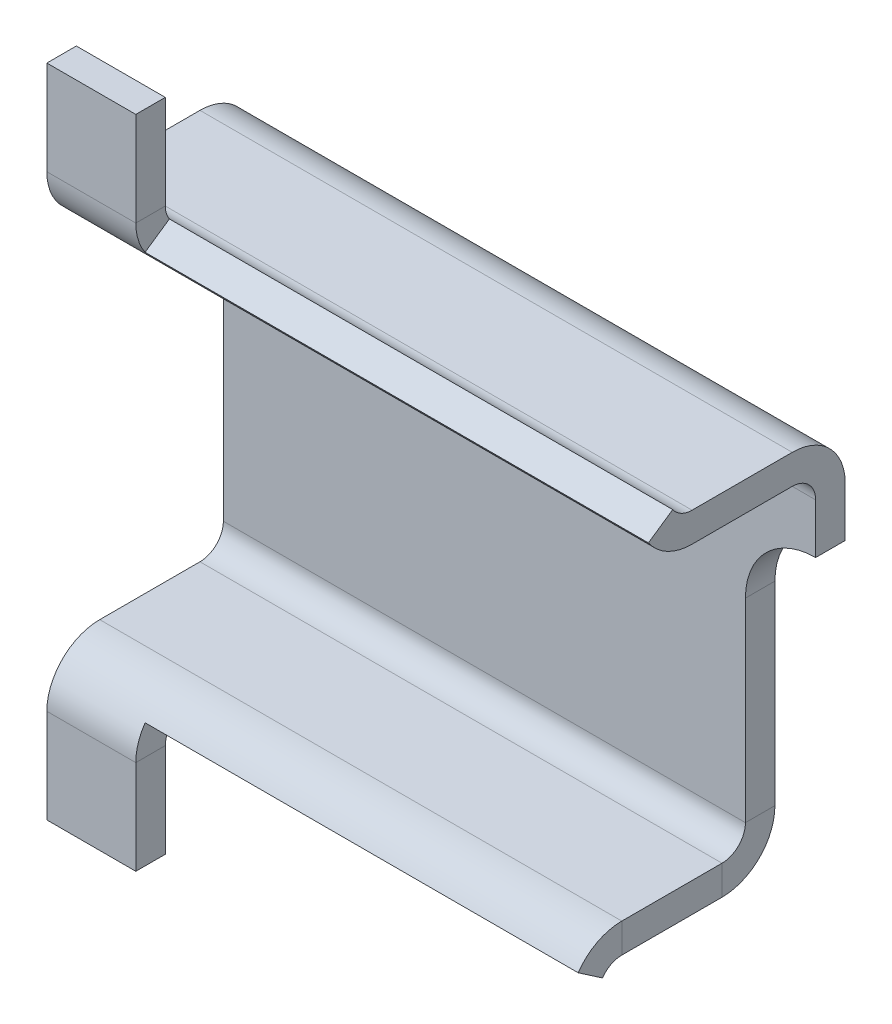
ISO-10303-21;
HEADER;
FILE_DESCRIPTION(('STEP AP214'),'2;1');
FILE_NAME('part.step','',(''),(''),'','','');
FILE_SCHEMA(('AUTOMOTIVE_DESIGN { 1 0 10303 214 1 1 1 1 }'));
ENDSEC;
DATA;
#1=APPLICATION_CONTEXT('core data for automotive mechanical design processes');
#2=APPLICATION_PROTOCOL_DEFINITION('international standard','automotive_design',2000,#1);
#3=PRODUCT_CONTEXT('',#1,'mechanical');
#4=PRODUCT('Part','Part','',(#3));
#5=PRODUCT_RELATED_PRODUCT_CATEGORY('part','',(#4));
#6=PRODUCT_DEFINITION_FORMATION('','',#4);
#7=PRODUCT_DEFINITION_CONTEXT('part definition',#1,'design');
#8=PRODUCT_DEFINITION('design','',#6,#7);
#9=PRODUCT_DEFINITION_SHAPE('','',#8);
#10=(LENGTH_UNIT() NAMED_UNIT(*) SI_UNIT(.MILLI.,.METRE.));
#11=(NAMED_UNIT(*) PLANE_ANGLE_UNIT() SI_UNIT($,.RADIAN.));
#12=(NAMED_UNIT(*) SI_UNIT($,.STERADIAN.) SOLID_ANGLE_UNIT());
#13=UNCERTAINTY_MEASURE_WITH_UNIT(LENGTH_MEASURE(1.E-05),#10,'distance_accuracy_value','');
#14=(GEOMETRIC_REPRESENTATION_CONTEXT(3) GLOBAL_UNCERTAINTY_ASSIGNED_CONTEXT((#13)) GLOBAL_UNIT_ASSIGNED_CONTEXT((#10,
#11,#12)) REPRESENTATION_CONTEXT('',''));
#15=CARTESIAN_POINT('',(0.,0.,0.));
#16=DIRECTION('',(0.,0.,1.));
#17=DIRECTION('',(1.,0.,0.));
#18=AXIS2_PLACEMENT_3D('',#15,#16,#17);
#19=CARTESIAN_POINT('',(25.4,1.52655665885959E-13,39.8799812000001));
#20=DIRECTION('',(0.,-1.,0.));
#21=DIRECTION('',(1.,0.,0.));
#22=AXIS2_PLACEMENT_3D('',#19,#20,#21);
#23=PLANE('',#22);
#24=DIRECTION('',(1.,0.,0.));
#25=VECTOR('',#24,1.);
#26=CARTESIAN_POINT('',(25.4,1.52655665885959E-13,47.8799906000001));
#27=LINE('',#26,#25);
#28=CARTESIAN_POINT('',(1.27,1.04777297948999E-13,47.8799906000001));
#29=VERTEX_POINT('',#28);
#30=CARTESIAN_POINT('',(25.4,1.52655665885959E-13,47.8799906000001));
#31=VERTEX_POINT('',#30);
#32=EDGE_CURVE('E351',#29,#31,#27,.T.);
#33=ORIENTED_EDGE('',*,*,#32,.F.);
#34=DIRECTION('',(0.,0.,1.));
#35=VECTOR('',#34,1.);
#36=CARTESIAN_POINT('',(1.27,1.04777297948999E-13,39.8799812000001));
#37=LINE('',#36,#35);
#38=CARTESIAN_POINT('',(1.27,1.04777297948999E-13,39.8799812000001));
#39=VERTEX_POINT('',#38);
#40=EDGE_CURVE('E297',#39,#29,#37,.T.);
#41=ORIENTED_EDGE('',*,*,#40,.F.);
#42=DIRECTION('',(1.,0.,0.));
#43=VECTOR('',#42,1.);
#44=CARTESIAN_POINT('',(25.4,1.52655665885959E-13,39.8799812000001));
#45=LINE('',#44,#43);
#46=CARTESIAN_POINT('',(25.4,1.52655665885959E-13,39.8799812000001));
#47=VERTEX_POINT('',#46);
#48=EDGE_CURVE('E364',#39,#47,#45,.T.);
#49=ORIENTED_EDGE('',*,*,#48,.T.);
#50=DIRECTION('',(0.,0.,1.));
#51=VECTOR('',#50,1.);
#52=CARTESIAN_POINT('',(25.4,1.52655665885959E-13,39.8799812000001));
#53=LINE('',#52,#51);
#54=EDGE_CURVE('E361',#47,#31,#53,.T.);
#55=ORIENTED_EDGE('',*,*,#54,.T.);
#56=EDGE_LOOP('',(#33,#41,#49,#55));
#57=FACE_BOUND('',#56,.T.);
#58=ADVANCED_FACE('F43',(#57),#23,.T.);
#59=CARTESIAN_POINT('',(0.,38.99547053014,47.8799906000001));
#60=DIRECTION('',(0.,0.,-1.));
#61=DIRECTION('',(-1.,0.,0.));
#62=AXIS2_PLACEMENT_3D('',#59,#60,#61);
#63=PLANE('',#62);
#64=DIRECTION('',(0.,1.,0.));
#65=VECTOR('',#64,1.);
#66=CARTESIAN_POINT('',(1.27,1.04777297948999E-13,47.8799906000001));
#67=LINE('',#66,#65);
#68=CARTESIAN_POINT('',(1.27,25.5288652825353,47.8799906000001));
#69=VERTEX_POINT('',#68);
#70=EDGE_CURVE('E299',#29,#69,#67,.T.);
#71=ORIENTED_EDGE('',*,*,#70,.F.);
#72=ORIENTED_EDGE('',*,*,#32,.T.);
#73=DIRECTION('',(0.,1.,0.));
#74=VECTOR('',#73,1.);
#75=CARTESIAN_POINT('',(25.4,31.7500000000001,47.8799906000001));
#76=LINE('',#75,#74);
#77=CARTESIAN_POINT('',(25.4,25.5288652825351,47.8799906000001));
#78=VERTEX_POINT('',#77);
#79=EDGE_CURVE('E347',#31,#78,#76,.T.);
#80=ORIENTED_EDGE('',*,*,#79,.T.);
#81=DIRECTION('',(1.,0.,0.));
#82=VECTOR('',#81,1.);
#83=CARTESIAN_POINT('',(0.,25.5288652825351,47.8799906000001));
#84=LINE('',#83,#82);
#85=EDGE_CURVE('E346',#69,#78,#84,.T.);
#86=ORIENTED_EDGE('',*,*,#85,.F.);
#87=EDGE_LOOP('',(#71,#72,#80,#86));
#88=FACE_BOUND('',#87,.T.);
#89=ADVANCED_FACE('F531',(#88),#63,.F.);
#90=CARTESIAN_POINT('',(0.,38.99547053014,39.8799812000001));
#91=DIRECTION('',(0.,0.,-1.));
#92=DIRECTION('',(-1.,0.,0.));
#93=AXIS2_PLACEMENT_3D('',#90,#91,#92);
#94=PLANE('',#93);
#95=ORIENTED_EDGE('',*,*,#48,.F.);
#96=DIRECTION('',(0.,-1.,0.));
#97=VECTOR('',#96,1.);
#98=CARTESIAN_POINT('',(1.27,25.5288652825351,39.8799812000001));
#99=LINE('',#98,#97);
#100=CARTESIAN_POINT('',(1.27,25.5288652825351,39.8799812000001));
#101=VERTEX_POINT('',#100);
#102=EDGE_CURVE('E295',#101,#39,#99,.T.);
#103=ORIENTED_EDGE('',*,*,#102,.F.);
#104=DIRECTION('',(1.,0.,0.));
#105=VECTOR('',#104,1.);
#106=CARTESIAN_POINT('',(0.,25.5288652825352,39.8799812000001));
#107=LINE('',#106,#105);
#108=CARTESIAN_POINT('',(25.4,25.5288652825351,39.8799812000001));
#109=VERTEX_POINT('',#108);
#110=EDGE_CURVE('E359',#101,#109,#107,.T.);
#111=ORIENTED_EDGE('',*,*,#110,.T.);
#112=DIRECTION('',(0.,1.,0.));
#113=VECTOR('',#112,1.);
#114=CARTESIAN_POINT('',(25.4,31.7500000000001,39.8799812000001));
#115=LINE('',#114,#113);
#116=EDGE_CURVE('E356',#47,#109,#115,.T.);
#117=ORIENTED_EDGE('',*,*,#116,.F.);
#118=EDGE_LOOP('',(#95,#103,#111,#117));
#119=FACE_BOUND('',#118,.T.);
#120=ADVANCED_FACE('F538',(#119),#94,.T.);
#121=CARTESIAN_POINT('',(549.698564164471,25.5288652825351,33.5299812000001));
#122=DIRECTION('',(-1.,0.,0.));
#123=DIRECTION('',(0.,0.,1.));
#124=AXIS2_PLACEMENT_3D('',#121,#122,#123);
#125=CYLINDRICAL_SURFACE('',#124,14.3500094);
#126=CARTESIAN_POINT('',(1.27,25.5288652825351,33.5299812000001));
#127=DIRECTION('',(-1.,0.,0.));
#128=DIRECTION('',(0.,0.,1.));
#129=AXIS2_PLACEMENT_3D('',#126,#127,#128);
#130=CIRCLE('',#129,14.3500094);
#131=CARTESIAN_POINT('',(1.27,39.8788746825351,33.5299812000001));
#132=VERTEX_POINT('',#131);
#133=EDGE_CURVE('E301',#69,#132,#130,.T.);
#134=ORIENTED_EDGE('',*,*,#133,.F.);
#135=ORIENTED_EDGE('',*,*,#85,.T.);
#136=CARTESIAN_POINT('',(25.4000000000004,25.5288652825351,33.5299812000001));
#137=DIRECTION('',(-1.,0.,0.));
#138=DIRECTION('',(0.,0.,1.));
#139=AXIS2_PLACEMENT_3D('',#136,#137,#138);
#140=CIRCLE('',#139,14.3500094);
#141=CARTESIAN_POINT('',(25.4000000000005,33.6442236929067,45.364833444591));
#142=VERTEX_POINT('',#141);
#143=EDGE_CURVE('E370',#142,#78,#140,.F.);
#144=ORIENTED_EDGE('',*,*,#143,.F.);
#145=DIRECTION('',(-1.,0.,0.));
#146=VECTOR('',#145,1.);
#147=CARTESIAN_POINT('',(549.698564164471,33.6442236929067,45.364833444591));
#148=LINE('',#147,#146);
#149=CARTESIAN_POINT('',(142.875,33.6442236929067,45.364833444591));
#150=VERTEX_POINT('',#149);
#151=EDGE_CURVE('E350',#150,#142,#148,.T.);
#152=ORIENTED_EDGE('',*,*,#151,.F.);
#153=CARTESIAN_POINT('',(142.875,25.5288652825351,33.5299812000001));
#154=DIRECTION('',(1.,0.,0.));
#155=DIRECTION('',(0.,0.,-1.));
#156=AXIS2_PLACEMENT_3D('',#153,#154,#155);
#157=CIRCLE('',#156,14.3500094);
#158=CARTESIAN_POINT('',(142.875,39.8788746825351,33.5299812000001));
#159=VERTEX_POINT('',#158);
#160=EDGE_CURVE('E436',#159,#150,#157,.T.);
#161=ORIENTED_EDGE('',*,*,#160,.F.);
#162=DIRECTION('',(1.,0.,0.));
#163=VECTOR('',#162,1.);
#164=CARTESIAN_POINT('',(0.,39.8788746825351,33.5299812000001));
#165=LINE('',#164,#163);
#166=EDGE_CURVE('E434',#132,#159,#165,.T.);
#167=ORIENTED_EDGE('',*,*,#166,.F.);
#168=EDGE_LOOP('',(#134,#135,#144,#152,#161,#167));
#169=FACE_BOUND('',#168,.T.);
#170=ADVANCED_FACE('F548',(#169),#125,.T.);
#171=CARTESIAN_POINT('',(549.698564164471,25.5288652825351,33.5299812000001));
#172=DIRECTION('',(-1.,0.,0.));
#173=DIRECTION('',(0.,0.,1.));
#174=AXIS2_PLACEMENT_3D('',#171,#172,#173);
#175=CYLINDRICAL_SURFACE('',#174,6.35);
#176=ORIENTED_EDGE('',*,*,#110,.F.);
#177=CARTESIAN_POINT('',(1.27,25.5288652825351,33.5299812000001));
#178=DIRECTION('',(1.,0.,0.));
#179=DIRECTION('',(0.,0.,1.));
#180=AXIS2_PLACEMENT_3D('',#177,#178,#179);
#181=CIRCLE('',#180,6.35);
#182=CARTESIAN_POINT('',(1.27,31.8788652825351,33.5299812000001));
#183=VERTEX_POINT('',#182);
#184=EDGE_CURVE('E293',#183,#101,#181,.T.);
#185=ORIENTED_EDGE('',*,*,#184,.F.);
#186=DIRECTION('',(1.,0.,0.));
#187=VECTOR('',#186,1.);
#188=CARTESIAN_POINT('',(0.,31.8788652825351,33.5299812000001));
#189=LINE('',#188,#187);
#190=CARTESIAN_POINT('',(142.875,31.8788652825351,33.5299812000001));
#191=VERTEX_POINT('',#190);
#192=EDGE_CURVE('E432',#183,#191,#189,.T.);
#193=ORIENTED_EDGE('',*,*,#192,.T.);
#194=CARTESIAN_POINT('',(142.875,25.5288652825351,33.5299812000001));
#195=DIRECTION('',(1.,0.,0.));
#196=DIRECTION('',(0.,0.,-1.));
#197=AXIS2_PLACEMENT_3D('',#194,#195,#196);
#198=CIRCLE('',#197,6.35);
#199=CARTESIAN_POINT('',(142.875,29.1199797180323,38.767002978756));
#200=VERTEX_POINT('',#199);
#201=EDGE_CURVE('E331',#191,#200,#198,.T.);
#202=ORIENTED_EDGE('',*,*,#201,.T.);
#203=DIRECTION('',(-1.,0.,0.));
#204=VECTOR('',#203,1.);
#205=CARTESIAN_POINT('',(25.4000000000002,29.1199797180323,38.767002978756));
#206=LINE('',#205,#204);
#207=CARTESIAN_POINT('',(25.4000000000002,29.1199797180323,38.767002978756));
#208=VERTEX_POINT('',#207);
#209=EDGE_CURVE('E367',#200,#208,#206,.T.);
#210=ORIENTED_EDGE('',*,*,#209,.T.);
#211=CARTESIAN_POINT('',(25.4000000000002,25.5288652825351,33.5299812000001));
#212=DIRECTION('',(1.,0.,0.));
#213=DIRECTION('',(0.,0.,1.));
#214=AXIS2_PLACEMENT_3D('',#211,#212,#213);
#215=CIRCLE('',#214,6.35);
#216=EDGE_CURVE('E369',#208,#109,#215,.T.);
#217=ORIENTED_EDGE('',*,*,#216,.T.);
#218=EDGE_LOOP('',(#176,#185,#193,#202,#210,#217));
#219=FACE_BOUND('',#218,.T.);
#220=ADVANCED_FACE('F555',(#219),#175,.F.);
#221=CARTESIAN_POINT('',(0.,177.8,39.8799812000001));
#222=DIRECTION('',(0.,1.,0.));
#223=DIRECTION('',(0.,0.,1.));
#224=AXIS2_PLACEMENT_3D('',#221,#222,#223);
#225=PLANE('',#224);
#226=DIRECTION('',(-1.,0.,0.));
#227=VECTOR('',#226,1.);
#228=CARTESIAN_POINT('',(0.,177.8,39.8799812000001));
#229=LINE('',#228,#227);
#230=CARTESIAN_POINT('',(25.4,177.8,39.8799812000001));
#231=VERTEX_POINT('',#230);
#232=CARTESIAN_POINT('',(1.27,177.8,39.8799812000001));
#233=VERTEX_POINT('',#232);
#234=EDGE_CURVE('E384',#231,#233,#229,.T.);
#235=ORIENTED_EDGE('',*,*,#234,.T.);
#236=DIRECTION('',(0.,0.,-1.));
#237=VECTOR('',#236,1.);
#238=CARTESIAN_POINT('',(1.27,177.8,47.8799906000001));
#239=LINE('',#238,#237);
#240=CARTESIAN_POINT('',(1.27,177.8,47.8799906000001));
#241=VERTEX_POINT('',#240);
#242=EDGE_CURVE('E268',#241,#233,#239,.T.);
#243=ORIENTED_EDGE('',*,*,#242,.F.);
#244=DIRECTION('',(-1.,0.,0.));
#245=VECTOR('',#244,1.);
#246=CARTESIAN_POINT('',(0.,177.8,47.8799906));
#247=LINE('',#246,#245);
#248=CARTESIAN_POINT('',(25.4,177.8,47.8799906));
#249=VERTEX_POINT('',#248);
#250=EDGE_CURVE('E420',#249,#241,#247,.T.);
#251=ORIENTED_EDGE('',*,*,#250,.F.);
#252=DIRECTION('',(0.,0.,1.));
#253=VECTOR('',#252,1.);
#254=CARTESIAN_POINT('',(25.4,177.8,39.8799812000001));
#255=LINE('',#254,#253);
#256=EDGE_CURVE('E425',#231,#249,#255,.T.);
#257=ORIENTED_EDGE('',*,*,#256,.F.);
#258=EDGE_LOOP('',(#235,#243,#251,#257));
#259=FACE_BOUND('',#258,.T.);
#260=ADVANCED_FACE('F509',(#259),#225,.T.);
#261=CARTESIAN_POINT('',(0.,39.8788746825351,36.3211253174651));
#262=DIRECTION('',(0.,-1.,0.));
#263=DIRECTION('',(-1.,0.,0.));
#264=AXIS2_PLACEMENT_3D('',#261,#262,#263);
#265=PLANE('',#264);
#266=DIRECTION('',(0.,0.,-1.));
#267=VECTOR('',#266,1.);
#268=CARTESIAN_POINT('',(1.27,39.8788746825351,33.5299812000001));
#269=LINE('',#268,#267);
#270=CARTESIAN_POINT('',(1.27,39.878874682535,6.35000000000008));
#271=VERTEX_POINT('',#270);
#272=EDGE_CURVE('E303',#132,#271,#269,.T.);
#273=ORIENTED_EDGE('',*,*,#272,.F.);
#274=ORIENTED_EDGE('',*,*,#166,.T.);
#275=DIRECTION('',(0.,0.,1.));
#276=VECTOR('',#275,1.);
#277=CARTESIAN_POINT('',(142.875,39.8788746825351,36.3211253174651));
#278=LINE('',#277,#276);
#279=CARTESIAN_POINT('',(142.875,39.878874682535,6.35000000000008));
#280=VERTEX_POINT('',#279);
#281=EDGE_CURVE('E322',#280,#159,#278,.T.);
#282=ORIENTED_EDGE('',*,*,#281,.F.);
#283=DIRECTION('',(1.,0.,0.));
#284=VECTOR('',#283,1.);
#285=CARTESIAN_POINT('',(0.,39.878874682535,6.35000000000008));
#286=LINE('',#285,#284);
#287=EDGE_CURVE('E379',#271,#280,#286,.T.);
#288=ORIENTED_EDGE('',*,*,#287,.F.);
#289=EDGE_LOOP('',(#273,#274,#282,#288));
#290=FACE_BOUND('',#289,.T.);
#291=ADVANCED_FACE('F650',(#290),#265,.F.);
#292=CARTESIAN_POINT('',(0.,31.8788652825351,36.3211253174651));
#293=DIRECTION('',(0.,-1.,0.));
#294=DIRECTION('',(-1.,0.,0.));
#295=AXIS2_PLACEMENT_3D('',#292,#293,#294);
#296=PLANE('',#295);
#297=ORIENTED_EDGE('',*,*,#192,.F.);
#298=DIRECTION('',(0.,0.,1.));
#299=VECTOR('',#298,1.);
#300=CARTESIAN_POINT('',(1.27,31.878865282535,6.3500000000001));
#301=LINE('',#300,#299);
#302=CARTESIAN_POINT('',(1.27,31.878865282535,6.3500000000001));
#303=VERTEX_POINT('',#302);
#304=EDGE_CURVE('E291',#303,#183,#301,.T.);
#305=ORIENTED_EDGE('',*,*,#304,.F.);
#306=DIRECTION('',(1.,0.,0.));
#307=VECTOR('',#306,1.);
#308=CARTESIAN_POINT('',(0.,31.878865282535,6.35000000000005));
#309=LINE('',#308,#307);
#310=CARTESIAN_POINT('',(142.875,31.878865282535,6.35000000000005));
#311=VERTEX_POINT('',#310);
#312=EDGE_CURVE('E380',#303,#311,#309,.T.);
#313=ORIENTED_EDGE('',*,*,#312,.T.);
#314=DIRECTION('',(0.,0.,1.));
#315=VECTOR('',#314,1.);
#316=CARTESIAN_POINT('',(142.875,31.8788652825351,36.3211253174651));
#317=LINE('',#316,#315);
#318=EDGE_CURVE('E334',#311,#191,#317,.T.);
#319=ORIENTED_EDGE('',*,*,#318,.T.);
#320=EDGE_LOOP('',(#297,#305,#313,#319));
#321=FACE_BOUND('',#320,.T.);
#322=ADVANCED_FACE('F626',(#321),#296,.T.);
#323=CARTESIAN_POINT('',(0.,-38.99547053014,39.8799812));
#324=DIRECTION('',(0.,0.,-1.));
#325=DIRECTION('',(-1.,0.,0.));
#326=AXIS2_PLACEMENT_3D('',#323,#324,#325);
#327=PLANE('',#326);
#328=DIRECTION('',(1.,0.,0.));
#329=VECTOR('',#328,1.);
#330=CARTESIAN_POINT('',(0.,152.271134717465,39.8799812));
#331=LINE('',#330,#329);
#332=CARTESIAN_POINT('',(1.27,152.271134717465,39.8799812000001));
#333=VERTEX_POINT('',#332);
#334=CARTESIAN_POINT('',(25.4,152.271134717465,39.8799812000001));
#335=VERTEX_POINT('',#334);
#336=EDGE_CURVE('E405',#333,#335,#331,.T.);
#337=ORIENTED_EDGE('',*,*,#336,.F.);
#338=DIRECTION('',(0.,-1.,0.));
#339=VECTOR('',#338,1.);
#340=CARTESIAN_POINT('',(1.27,177.8,39.8799812000001));
#341=LINE('',#340,#339);
#342=EDGE_CURVE('E270',#233,#333,#341,.T.);
#343=ORIENTED_EDGE('',*,*,#342,.F.);
#344=ORIENTED_EDGE('',*,*,#234,.F.);
#345=DIRECTION('',(0.,1.,0.));
#346=VECTOR('',#345,1.);
#347=CARTESIAN_POINT('',(25.4,177.8,39.8799812000001));
#348=LINE('',#347,#346);
#349=EDGE_CURVE('E423',#335,#231,#348,.T.);
#350=ORIENTED_EDGE('',*,*,#349,.F.);
#351=EDGE_LOOP('',(#337,#343,#344,#350));
#352=FACE_BOUND('',#351,.T.);
#353=ADVANCED_FACE('F505',(#352),#327,.T.);
#354=CARTESIAN_POINT('',(0.,145.921134717466,-141.478874682535));
#355=DIRECTION('',(0.,1.,0.));
#356=DIRECTION('',(-1.,0.,0.));
#357=AXIS2_PLACEMENT_3D('',#354,#355,#356);
#358=PLANE('',#357);
#359=DIRECTION('',(1.,0.,0.));
#360=VECTOR('',#359,1.);
#361=CARTESIAN_POINT('',(0.,145.921134717465,6.35000000000005));
#362=LINE('',#361,#360);
#363=CARTESIAN_POINT('',(1.27,145.921134717465,6.35000000000004));
#364=VERTEX_POINT('',#363);
#365=CARTESIAN_POINT('',(161.925,145.921134717465,6.35000000000005));
#366=VERTEX_POINT('',#365);
#367=EDGE_CURVE('E391',#364,#366,#362,.T.);
#368=ORIENTED_EDGE('',*,*,#367,.F.);
#369=DIRECTION('',(0.,0.,-1.));
#370=VECTOR('',#369,1.);
#371=CARTESIAN_POINT('',(1.27,145.921134717465,33.5299812));
#372=LINE('',#371,#370);
#373=CARTESIAN_POINT('',(1.27,145.921134717465,33.5299812));
#374=VERTEX_POINT('',#373);
#375=EDGE_CURVE('E284',#374,#364,#372,.T.);
#376=ORIENTED_EDGE('',*,*,#375,.F.);
#377=DIRECTION('',(1.,0.,0.));
#378=VECTOR('',#377,1.);
#379=CARTESIAN_POINT('',(0.,145.921134717465,33.5299812));
#380=LINE('',#379,#378);
#381=CARTESIAN_POINT('',(161.925,145.921134717465,33.5299812));
#382=VERTEX_POINT('',#381);
#383=EDGE_CURVE('E47',#374,#382,#380,.T.);
#384=ORIENTED_EDGE('',*,*,#383,.T.);
#385=DIRECTION('',(0.,0.,1.));
#386=VECTOR('',#385,1.);
#387=CARTESIAN_POINT('',(161.925,145.921134717466,-141.478874682535));
#388=LINE('',#387,#386);
#389=EDGE_CURVE('E464',#366,#382,#388,.T.);
#390=ORIENTED_EDGE('',*,*,#389,.F.);
#391=EDGE_LOOP('',(#368,#376,#384,#390));
#392=FACE_BOUND('',#391,.T.);
#393=ADVANCED_FACE('F481',(#392),#358,.T.);
#394=CARTESIAN_POINT('',(0.,-38.99547053014,47.8799906));
#395=DIRECTION('',(0.,0.,-1.));
#396=DIRECTION('',(-1.,0.,0.));
#397=AXIS2_PLACEMENT_3D('',#394,#395,#396);
#398=PLANE('',#397);
#399=DIRECTION('',(0.,1.,0.));
#400=VECTOR('',#399,1.);
#401=CARTESIAN_POINT('',(1.27,152.271134717465,47.8799906));
#402=LINE('',#401,#400);
#403=CARTESIAN_POINT('',(1.27,152.271134717465,47.8799906));
#404=VERTEX_POINT('',#403);
#405=EDGE_CURVE('E266',#404,#241,#402,.T.);
#406=ORIENTED_EDGE('',*,*,#405,.F.);
#407=DIRECTION('',(1.,0.,0.));
#408=VECTOR('',#407,1.);
#409=CARTESIAN_POINT('',(0.,152.271134717465,47.8799906));
#410=LINE('',#409,#408);
#411=CARTESIAN_POINT('',(25.4,152.271134717465,47.8799906));
#412=VERTEX_POINT('',#411);
#413=EDGE_CURVE('E416',#404,#412,#410,.T.);
#414=ORIENTED_EDGE('',*,*,#413,.T.);
#415=DIRECTION('',(0.,1.,0.));
#416=VECTOR('',#415,1.);
#417=CARTESIAN_POINT('',(25.4,177.8,47.8799906));
#418=LINE('',#417,#416);
#419=EDGE_CURVE('E418',#412,#249,#418,.T.);
#420=ORIENTED_EDGE('',*,*,#419,.T.);
#421=ORIENTED_EDGE('',*,*,#250,.T.);
#422=EDGE_LOOP('',(#406,#414,#420,#421));
#423=FACE_BOUND('',#422,.T.);
#424=ADVANCED_FACE('F513',(#423),#398,.F.);
#425=CARTESIAN_POINT('',(0.,137.921125317466,-141.478874682535));
#426=DIRECTION('',(0.,1.,0.));
#427=DIRECTION('',(-1.,0.,0.));
#428=AXIS2_PLACEMENT_3D('',#425,#426,#427);
#429=PLANE('',#428);
#430=DIRECTION('',(0.,0.,1.));
#431=VECTOR('',#430,1.);
#432=CARTESIAN_POINT('',(1.27,137.921125317465,6.35000000000002));
#433=LINE('',#432,#431);
#434=CARTESIAN_POINT('',(1.27,137.921125317465,6.35000000000002));
#435=VERTEX_POINT('',#434);
#436=CARTESIAN_POINT('',(1.27,137.921125317465,33.5299812));
#437=VERTEX_POINT('',#436);
#438=EDGE_CURVE('E311',#435,#437,#433,.T.);
#439=ORIENTED_EDGE('',*,*,#438,.F.);
#440=DIRECTION('',(1.,0.,0.));
#441=VECTOR('',#440,1.);
#442=CARTESIAN_POINT('',(0.,137.921125317465,6.34999999999997));
#443=LINE('',#442,#441);
#444=CARTESIAN_POINT('',(161.925,137.921125317465,6.34999999999997));
#445=VERTEX_POINT('',#444);
#446=EDGE_CURVE('E388',#435,#445,#443,.T.);
#447=ORIENTED_EDGE('',*,*,#446,.T.);
#448=DIRECTION('',(0.,0.,1.));
#449=VECTOR('',#448,1.);
#450=CARTESIAN_POINT('',(161.925,137.921125317466,-141.478874682535));
#451=LINE('',#450,#449);
#452=CARTESIAN_POINT('',(161.925,137.921125317465,33.5299811999999));
#453=VERTEX_POINT('',#452);
#454=EDGE_CURVE('E461',#445,#453,#451,.T.);
#455=ORIENTED_EDGE('',*,*,#454,.T.);
#456=DIRECTION('',(1.,0.,0.));
#457=VECTOR('',#456,1.);
#458=CARTESIAN_POINT('',(0.,137.921125317465,33.5299811999999));
#459=LINE('',#458,#457);
#460=EDGE_CURVE('E383',#437,#453,#459,.T.);
#461=ORIENTED_EDGE('',*,*,#460,.F.);
#462=EDGE_LOOP('',(#439,#447,#455,#461));
#463=FACE_BOUND('',#462,.T.);
#464=ADVANCED_FACE('F518',(#463),#429,.F.);
#465=CARTESIAN_POINT('',(-225.848564164472,152.271134717465,33.5299812000001));
#466=DIRECTION('',(1.,0.,0.));
#467=DIRECTION('',(0.,0.,-1.));
#468=AXIS2_PLACEMENT_3D('',#465,#466,#467);
#469=CYLINDRICAL_SURFACE('',#468,14.3500094);
#470=CARTESIAN_POINT('',(1.27,152.271134717465,33.5299812000001));
#471=DIRECTION('',(-1.,0.,0.));
#472=DIRECTION('',(0.,0.,1.));
#473=AXIS2_PLACEMENT_3D('',#470,#471,#472);
#474=CIRCLE('',#473,14.3500093999992);
#475=CARTESIAN_POINT('',(1.27,142.843251511067,44.3483816375222));
#476=VERTEX_POINT('',#475);
#477=EDGE_CURVE('E313',#437,#476,#474,.T.);
#478=ORIENTED_EDGE('',*,*,#477,.F.);
#479=ORIENTED_EDGE('',*,*,#460,.T.);
#480=CARTESIAN_POINT('',(161.925,152.271134717465,33.5299812000001));
#481=DIRECTION('',(-1.,0.,0.));
#482=DIRECTION('',(0.,0.,1.));
#483=AXIS2_PLACEMENT_3D('',#480,#481,#482);
#484=CIRCLE('',#483,14.3500094);
#485=CARTESIAN_POINT('',(161.925,144.155776307093,45.3648334445909));
#486=VERTEX_POINT('',#485);
#487=EDGE_CURVE('E69',#453,#486,#484,.T.);
#488=ORIENTED_EDGE('',*,*,#487,.T.);
#489=DIRECTION('',(1.,0.,0.));
#490=VECTOR('',#489,1.);
#491=CARTESIAN_POINT('',(-225.848564164472,144.155776307093,45.3648334445909));
#492=LINE('',#491,#490);
#493=CARTESIAN_POINT('',(25.4,144.155776307093,45.3648334445909));
#494=VERTEX_POINT('',#493);
#495=EDGE_CURVE('E399',#494,#486,#492,.T.);
#496=ORIENTED_EDGE('',*,*,#495,.F.);
#497=CARTESIAN_POINT('',(25.4,152.271134717465,33.5299812000001));
#498=DIRECTION('',(1.,0.,0.));
#499=DIRECTION('',(0.,0.,-1.));
#500=AXIS2_PLACEMENT_3D('',#497,#498,#499);
#501=CIRCLE('',#500,14.3500094);
#502=EDGE_CURVE('E400',#412,#494,#501,.T.);
#503=ORIENTED_EDGE('',*,*,#502,.F.);
#504=ORIENTED_EDGE('',*,*,#413,.F.);
#505=CARTESIAN_POINT('',(1.27,152.271134717465,33.5299812000001));
#506=DIRECTION('',(-1.,0.,0.));
#507=DIRECTION('',(0.,0.,1.));
#508=AXIS2_PLACEMENT_3D('',#505,#506,#507);
#509=CIRCLE('',#508,14.3500094);
#510=CARTESIAN_POINT('',(1.27,144.181328965036,45.3823148380667));
#511=VERTEX_POINT('',#510);
#512=EDGE_CURVE('E264',#511,#404,#509,.T.);
#513=ORIENTED_EDGE('',*,*,#512,.F.);
#514=DIRECTION('',(0.,0.825929349737707,0.563773632978564));
#515=VECTOR('',#514,1.);
#516=CARTESIAN_POINT('',(1.27,144.180652949123,45.381853394304));
#517=LINE('',#516,#515);
#518=CARTESIAN_POINT('',(1.27,144.180652949123,45.381853394304));
#519=VERTEX_POINT('',#518);
#520=EDGE_CURVE('E260',#519,#511,#517,.T.);
#521=ORIENTED_EDGE('',*,*,#520,.F.);
#522=DIRECTION('',(0.,0.825321340616689,0.564663337505341));
#523=VECTOR('',#522,1.);
#524=CARTESIAN_POINT('',(1.27,144.155776307093,45.3648334445909));
#525=LINE('',#524,#523);
#526=CARTESIAN_POINT('',(1.27,144.155776307093,45.3648334445909));
#527=VERTEX_POINT('',#526);
#528=EDGE_CURVE('E258',#527,#519,#525,.T.);
#529=ORIENTED_EDGE('',*,*,#528,.F.);
#530=DIRECTION('',(0.,0.824720800433507,0.565540097015513));
#531=VECTOR('',#530,1.);
#532=CARTESIAN_POINT('',(1.27,144.155776307093,45.3648334445909));
#533=LINE('',#532,#531);
#534=CARTESIAN_POINT('',(1.27,144.155481709525,45.3646314286635));
#535=VERTEX_POINT('',#534);
#536=EDGE_CURVE('E252',#535,#527,#533,.T.);
#537=ORIENTED_EDGE('',*,*,#536,.F.);
#538=CARTESIAN_POINT('',(1.27,152.271134717465,33.5299812000001));
#539=DIRECTION('',(-1.,0.,0.));
#540=DIRECTION('',(0.,0.,1.));
#541=AXIS2_PLACEMENT_3D('',#538,#539,#540);
#542=CIRCLE('',#541,14.3500094);
#543=CARTESIAN_POINT('',(1.27,142.843546503242,44.3486387065088));
#544=VERTEX_POINT('',#543);
#545=EDGE_CURVE('E248',#544,#535,#542,.T.);
#546=ORIENTED_EDGE('',*,*,#545,.F.);
#547=DIRECTION('',(0.,0.753903961535753,0.656984639683987));
#548=VECTOR('',#547,1.);
#549=CARTESIAN_POINT('',(1.27,142.843251511067,44.3483816375217));
#550=LINE('',#549,#548);
#551=EDGE_CURVE('E254',#476,#544,#550,.T.);
#552=ORIENTED_EDGE('',*,*,#551,.F.);
#553=EDGE_LOOP('',(#478,#479,#488,#496,#503,#504,#513,#521,#529,#537,#546,#552));
#554=FACE_BOUND('',#553,.T.);
#555=ADVANCED_FACE('F257',(#554),#469,.T.);
#556=CARTESIAN_POINT('',(-225.848564164472,152.271134717465,33.5299812000001));
#557=DIRECTION('',(1.,0.,0.));
#558=DIRECTION('',(0.,0.,-1.));
#559=AXIS2_PLACEMENT_3D('',#556,#557,#558);
#560=CYLINDRICAL_SURFACE('',#559,6.35);
#561=ORIENTED_EDGE('',*,*,#383,.F.);
#562=CARTESIAN_POINT('',(1.27,152.271134717465,33.5299812000001));
#563=DIRECTION('',(1.,0.,0.));
#564=DIRECTION('',(0.,0.,1.));
#565=AXIS2_PLACEMENT_3D('',#562,#563,#564);
#566=CIRCLE('',#565,6.34999999999999);
#567=CARTESIAN_POINT('',(1.27,148.099232454589,38.3172279566456));
#568=VERTEX_POINT('',#567);
#569=EDGE_CURVE('E282',#568,#374,#566,.T.);
#570=ORIENTED_EDGE('',*,*,#569,.F.);
#571=DIRECTION('',(0.,-0.753905024101771,-0.656983420364706));
#572=VECTOR('',#571,1.);
#573=CARTESIAN_POINT('',(1.27,148.099347543562,38.3173282498445));
#574=LINE('',#573,#572);
#575=CARTESIAN_POINT('',(1.27,148.099347543562,38.3173282498445));
#576=VERTEX_POINT('',#575);
#577=EDGE_CURVE('E280',#576,#568,#574,.T.);
#578=ORIENTED_EDGE('',*,*,#577,.F.);
#579=CARTESIAN_POINT('',(1.27,152.271134717465,33.5299812000001));
#580=DIRECTION('',(1.,0.,0.));
#581=DIRECTION('',(0.,0.,1.));
#582=AXIS2_PLACEMENT_3D('',#579,#580,#581);
#583=CIRCLE('',#582,6.35);
#584=CARTESIAN_POINT('',(1.27,148.679889920063,38.7669135850069));
#585=VERTEX_POINT('',#584);
#586=EDGE_CURVE('E277',#585,#576,#583,.T.);
#587=ORIENTED_EDGE('',*,*,#586,.F.);
#588=DIRECTION('',(0.,-0.825319660691218,-0.564665792904558));
#589=VECTOR('',#588,1.);
#590=CARTESIAN_POINT('',(1.27,148.691128066931,38.7746024810968));
#591=LINE('',#590,#589);
#592=CARTESIAN_POINT('',(1.27,148.691128066931,38.7746024810968));
#593=VERTEX_POINT('',#592);
#594=EDGE_CURVE('E275',#593,#585,#591,.T.);
#595=ORIENTED_EDGE('',*,*,#594,.F.);
#596=CARTESIAN_POINT('',(1.27,152.271134717465,33.5299812000001));
#597=DIRECTION('',(1.,0.,0.));
#598=DIRECTION('',(0.,0.,1.));
#599=AXIS2_PLACEMENT_3D('',#596,#597,#598);
#600=CIRCLE('',#599,6.35);
#601=EDGE_CURVE('E272',#333,#593,#600,.T.);
#602=ORIENTED_EDGE('',*,*,#601,.F.);
#603=ORIENTED_EDGE('',*,*,#336,.T.);
#604=CARTESIAN_POINT('',(25.4,152.271134717465,33.5299812000001));
#605=DIRECTION('',(1.,0.,0.));
#606=DIRECTION('',(0.,0.,1.));
#607=AXIS2_PLACEMENT_3D('',#604,#605,#606);
#608=CIRCLE('',#607,6.35);
#609=CARTESIAN_POINT('',(25.4,148.680020281968,38.767002978756));
#610=VERTEX_POINT('',#609);
#611=EDGE_CURVE('E408',#335,#610,#608,.T.);
#612=ORIENTED_EDGE('',*,*,#611,.T.);
#613=DIRECTION('',(1.,0.,0.));
#614=VECTOR('',#613,1.);
#615=CARTESIAN_POINT('',(298.45,148.680020281968,38.767002978756));
#616=LINE('',#615,#614);
#617=CARTESIAN_POINT('',(161.925,148.680020281968,38.767002978756));
#618=VERTEX_POINT('',#617);
#619=EDGE_CURVE('E385',#610,#618,#616,.T.);
#620=ORIENTED_EDGE('',*,*,#619,.T.);
#621=CARTESIAN_POINT('',(161.925,152.271134717465,33.5299812000001));
#622=DIRECTION('',(-1.,0.,0.));
#623=DIRECTION('',(0.,0.,1.));
#624=AXIS2_PLACEMENT_3D('',#621,#622,#623);
#625=CIRCLE('',#624,6.35);
#626=EDGE_CURVE('E455',#382,#618,#625,.T.);
#627=ORIENTED_EDGE('',*,*,#626,.F.);
#628=EDGE_LOOP('',(#561,#570,#578,#587,#595,#602,#603,#612,#620,#627));
#629=FACE_BOUND('',#628,.T.);
#630=ADVANCED_FACE('F486',(#629),#560,.F.);
#631=CARTESIAN_POINT('',(549.698564164471,46.228874682535,6.35));
#632=DIRECTION('',(-1.,0.,0.));
#633=DIRECTION('',(0.,0.,1.));
#634=AXIS2_PLACEMENT_3D('',#631,#632,#633);
#635=CYLINDRICAL_SURFACE('',#634,6.35);
#636=CARTESIAN_POINT('',(1.27,46.228874682535,6.35));
#637=DIRECTION('',(1.,0.,0.));
#638=DIRECTION('',(0.,0.,1.));
#639=AXIS2_PLACEMENT_3D('',#636,#637,#638);
#640=CIRCLE('',#639,6.35);
#641=CARTESIAN_POINT('',(1.27,46.228874682535,0.));
#642=VERTEX_POINT('',#641);
#643=EDGE_CURVE('E305',#271,#642,#640,.T.);
#644=ORIENTED_EDGE('',*,*,#643,.F.);
#645=ORIENTED_EDGE('',*,*,#287,.T.);
#646=CARTESIAN_POINT('',(142.875,46.228874682535,6.35));
#647=DIRECTION('',(1.,0.,0.));
#648=DIRECTION('',(0.,0.,-1.));
#649=AXIS2_PLACEMENT_3D('',#646,#647,#648);
#650=CIRCLE('',#649,6.35);
#651=CARTESIAN_POINT('',(142.875,46.228874682535,0.));
#652=VERTEX_POINT('',#651);
#653=EDGE_CURVE('E325',#652,#280,#650,.F.);
#654=ORIENTED_EDGE('',*,*,#653,.F.);
#655=DIRECTION('',(1.,0.,0.));
#656=VECTOR('',#655,1.);
#657=CARTESIAN_POINT('',(0.,46.228874682535,0.));
#658=LINE('',#657,#656);
#659=EDGE_CURVE('E430',#642,#652,#658,.T.);
#660=ORIENTED_EDGE('',*,*,#659,.F.);
#661=EDGE_LOOP('',(#644,#645,#654,#660));
#662=FACE_BOUND('',#661,.T.);
#663=ADVANCED_FACE('F575',(#662),#635,.F.);
#664=CARTESIAN_POINT('',(-225.848564164471,131.571125317465,6.35));
#665=DIRECTION('',(1.,0.,0.));
#666=DIRECTION('',(0.,0.,-1.));
#667=AXIS2_PLACEMENT_3D('',#664,#665,#666);
#668=CYLINDRICAL_SURFACE('',#667,6.35);
#669=CARTESIAN_POINT('',(1.27,131.571125317465,6.35));
#670=DIRECTION('',(1.,0.,0.));
#671=DIRECTION('',(0.,0.,1.));
#672=AXIS2_PLACEMENT_3D('',#669,#670,#671);
#673=CIRCLE('',#672,6.35);
#674=CARTESIAN_POINT('',(1.27,131.571125317465,0.));
#675=VERTEX_POINT('',#674);
#676=EDGE_CURVE('E309',#675,#435,#673,.T.);
#677=ORIENTED_EDGE('',*,*,#676,.F.);
#678=DIRECTION('',(1.,0.,0.));
#679=VECTOR('',#678,1.);
#680=CARTESIAN_POINT('',(0.,131.571125317465,0.));
#681=LINE('',#680,#679);
#682=CARTESIAN_POINT('',(161.925,131.571125317465,0.));
#683=VERTEX_POINT('',#682);
#684=EDGE_CURVE('E393',#675,#683,#681,.T.);
#685=ORIENTED_EDGE('',*,*,#684,.T.);
#686=CARTESIAN_POINT('',(161.925,131.571125317465,6.35));
#687=DIRECTION('',(-1.,0.,0.));
#688=DIRECTION('',(0.,0.,1.));
#689=AXIS2_PLACEMENT_3D('',#686,#687,#688);
#690=CIRCLE('',#689,6.35);
#691=EDGE_CURVE('E458',#683,#445,#690,.F.);
#692=ORIENTED_EDGE('',*,*,#691,.T.);
#693=ORIENTED_EDGE('',*,*,#446,.F.);
#694=EDGE_LOOP('',(#677,#685,#692,#693));
#695=FACE_BOUND('',#694,.T.);
#696=ADVANCED_FACE('F577',(#695),#668,.F.);
#697=CARTESIAN_POINT('',(-225.848564164471,131.571125317465,6.35));
#698=DIRECTION('',(1.,0.,0.));
#699=DIRECTION('',(0.,0.,-1.));
#700=AXIS2_PLACEMENT_3D('',#697,#698,#699);
#701=CYLINDRICAL_SURFACE('',#700,14.3500094);
#702=DIRECTION('',(1.,0.,0.));
#703=VECTOR('',#702,1.);
#704=CARTESIAN_POINT('',(0.,131.571125317465,-8.0000094));
#705=LINE('',#704,#703);
#706=CARTESIAN_POINT('',(1.27,131.571125317465,-8.0000094));
#707=VERTEX_POINT('',#706);
#708=CARTESIAN_POINT('',(161.925,131.571125317465,-8.0000094));
#709=VERTEX_POINT('',#708);
#710=EDGE_CURVE('E390',#707,#709,#705,.T.);
#711=ORIENTED_EDGE('',*,*,#710,.F.);
#712=CARTESIAN_POINT('',(1.27,131.571125317465,6.35));
#713=DIRECTION('',(-1.,0.,0.));
#714=DIRECTION('',(0.,0.,1.));
#715=AXIS2_PLACEMENT_3D('',#712,#713,#714);
#716=CIRCLE('',#715,14.3500093999998);
#717=EDGE_CURVE('E61',#364,#707,#716,.T.);
#718=ORIENTED_EDGE('',*,*,#717,.F.);
#719=ORIENTED_EDGE('',*,*,#367,.T.);
#720=CARTESIAN_POINT('',(161.925,131.571125317465,6.35));
#721=DIRECTION('',(-1.,0.,0.));
#722=DIRECTION('',(0.,0.,1.));
#723=AXIS2_PLACEMENT_3D('',#720,#721,#722);
#724=CIRCLE('',#723,14.3500094);
#725=EDGE_CURVE('E468',#709,#366,#724,.F.);
#726=ORIENTED_EDGE('',*,*,#725,.F.);
#727=EDGE_LOOP('',(#711,#718,#719,#726));
#728=FACE_BOUND('',#727,.T.);
#729=ADVANCED_FACE('F477',(#728),#701,.T.);
#730=CARTESIAN_POINT('',(549.698564164471,46.228874682535,6.35));
#731=DIRECTION('',(-1.,0.,0.));
#732=DIRECTION('',(0.,0.,1.));
#733=AXIS2_PLACEMENT_3D('',#730,#731,#732);
#734=CYLINDRICAL_SURFACE('',#733,14.3500094);
#735=ORIENTED_EDGE('',*,*,#312,.F.);
#736=CARTESIAN_POINT('',(1.27,46.228874682535,6.35));
#737=DIRECTION('',(-1.,0.,0.));
#738=DIRECTION('',(0.,0.,1.));
#739=AXIS2_PLACEMENT_3D('',#736,#737,#738);
#740=CIRCLE('',#739,14.3500094);
#741=CARTESIAN_POINT('',(1.27,46.228874682535,-8.0000094));
#742=VERTEX_POINT('',#741);
#743=EDGE_CURVE('E289',#742,#303,#740,.T.);
#744=ORIENTED_EDGE('',*,*,#743,.F.);
#745=DIRECTION('',(1.,0.,0.));
#746=VECTOR('',#745,1.);
#747=CARTESIAN_POINT('',(0.,46.228874682535,-8.0000094));
#748=LINE('',#747,#746);
#749=CARTESIAN_POINT('',(142.875,46.228874682535,-8.0000094));
#750=VERTEX_POINT('',#749);
#751=EDGE_CURVE('E428',#742,#750,#748,.T.);
#752=ORIENTED_EDGE('',*,*,#751,.T.);
#753=CARTESIAN_POINT('',(142.875,46.228874682535,6.35));
#754=DIRECTION('',(1.,0.,0.));
#755=DIRECTION('',(0.,0.,-1.));
#756=AXIS2_PLACEMENT_3D('',#753,#754,#755);
#757=CIRCLE('',#756,14.3500094);
#758=EDGE_CURVE('E337',#750,#311,#757,.F.);
#759=ORIENTED_EDGE('',*,*,#758,.T.);
#760=EDGE_LOOP('',(#735,#744,#752,#759));
#761=FACE_BOUND('',#760,.T.);
#762=ADVANCED_FACE('F570',(#761),#734,.T.);
#763=CARTESIAN_POINT('',(0.,0.,0.));
#764=DIRECTION('',(0.,0.,-1.));
#765=DIRECTION('',(-1.,0.,0.));
#766=AXIS2_PLACEMENT_3D('',#763,#764,#765);
#767=PLANE('',#766);
#768=DIRECTION('',(0.,1.,0.));
#769=VECTOR('',#768,1.);
#770=CARTESIAN_POINT('',(1.27,46.228874682535,0.));
#771=LINE('',#770,#769);
#772=EDGE_CURVE('E307',#642,#675,#771,.T.);
#773=ORIENTED_EDGE('',*,*,#772,.F.);
#774=ORIENTED_EDGE('',*,*,#659,.T.);
#775=DIRECTION('',(0.,-1.,0.));
#776=VECTOR('',#775,1.);
#777=CARTESIAN_POINT('',(142.875,0.,0.));
#778=LINE('',#777,#776);
#779=CARTESIAN_POINT('',(142.875,98.9699797180323,0.));
#780=VERTEX_POINT('',#779);
#781=EDGE_CURVE('E328',#780,#652,#778,.T.);
#782=ORIENTED_EDGE('',*,*,#781,.F.);
#783=CARTESIAN_POINT('',(161.925,98.9699797180323,0.));
#784=DIRECTION('',(0.,0.,-1.));
#785=DIRECTION('',(-1.,0.,0.));
#786=AXIS2_PLACEMENT_3D('',#783,#784,#785);
#787=CIRCLE('',#786,19.05);
#788=CARTESIAN_POINT('',(161.925,118.019979718032,0.));
#789=VERTEX_POINT('',#788);
#790=EDGE_CURVE('E343',#780,#789,#787,.T.);
#791=ORIENTED_EDGE('',*,*,#790,.T.);
#792=DIRECTION('',(0.,1.,0.));
#793=VECTOR('',#792,1.);
#794=CARTESIAN_POINT('',(161.925,0.,0.));
#795=LINE('',#794,#793);
#796=EDGE_CURVE('E452',#789,#683,#795,.T.);
#797=ORIENTED_EDGE('',*,*,#796,.T.);
#798=ORIENTED_EDGE('',*,*,#684,.F.);
#799=EDGE_LOOP('',(#773,#774,#782,#791,#797,#798));
#800=FACE_BOUND('',#799,.T.);
#801=ADVANCED_FACE('F573',(#800),#767,.F.);
#802=CARTESIAN_POINT('',(0.,0.,-8.0000094));
#803=DIRECTION('',(0.,0.,-1.));
#804=DIRECTION('',(-1.,0.,0.));
#805=AXIS2_PLACEMENT_3D('',#802,#803,#804);
#806=PLANE('',#805);
#807=ORIENTED_EDGE('',*,*,#751,.F.);
#808=DIRECTION('',(0.,-1.,0.));
#809=VECTOR('',#808,1.);
#810=CARTESIAN_POINT('',(1.27,131.571125317465,-8.0000094));
#811=LINE('',#810,#809);
#812=EDGE_CURVE('E287',#707,#742,#811,.T.);
#813=ORIENTED_EDGE('',*,*,#812,.F.);
#814=ORIENTED_EDGE('',*,*,#710,.T.);
#815=DIRECTION('',(0.,1.,0.));
#816=VECTOR('',#815,1.);
#817=CARTESIAN_POINT('',(161.925,0.,-8.0000094));
#818=LINE('',#817,#816);
#819=CARTESIAN_POINT('',(161.925,118.019979718032,-8.0000094));
#820=VERTEX_POINT('',#819);
#821=EDGE_CURVE('E53',#820,#709,#818,.T.);
#822=ORIENTED_EDGE('',*,*,#821,.F.);
#823=CARTESIAN_POINT('',(161.925,98.9699797180323,-8.0000094));
#824=DIRECTION('',(0.,0.,-1.));
#825=DIRECTION('',(-1.,0.,0.));
#826=AXIS2_PLACEMENT_3D('',#823,#824,#825);
#827=CIRCLE('',#826,19.05);
#828=CARTESIAN_POINT('',(142.875,98.9699797180323,-8.0000094));
#829=VERTEX_POINT('',#828);
#830=EDGE_CURVE('E438',#829,#820,#827,.T.);
#831=ORIENTED_EDGE('',*,*,#830,.F.);
#832=DIRECTION('',(0.,-1.,0.));
#833=VECTOR('',#832,1.);
#834=CARTESIAN_POINT('',(142.875,0.,-8.0000094));
#835=LINE('',#834,#833);
#836=EDGE_CURVE('E340',#829,#750,#835,.T.);
#837=ORIENTED_EDGE('',*,*,#836,.T.);
#838=EDGE_LOOP('',(#807,#813,#814,#822,#831,#837));
#839=FACE_BOUND('',#838,.T.);
#840=ADVANCED_FACE('F635',(#839),#806,.T.);
#841=CARTESIAN_POINT('',(161.925,13.8318679814657,47.8899906000001));
#842=DIRECTION('',(-1.,0.,0.));
#843=DIRECTION('',(0.,0.,1.));
#844=AXIS2_PLACEMENT_3D('',#841,#842,#843);
#845=PLANE('',#844);
#846=ORIENTED_EDGE('',*,*,#725,.T.);
#847=ORIENTED_EDGE('',*,*,#389,.T.);
#848=ORIENTED_EDGE('',*,*,#626,.T.);
#849=DIRECTION('',(0.,0.56552983236176,-0.82472783917416));
#850=VECTOR('',#849,1.);
#851=CARTESIAN_POINT('',(161.925,148.680020281968,38.767002978756));
#852=LINE('',#851,#850);
#853=EDGE_CURVE('E11',#618,#486,#852,.F.);
#854=ORIENTED_EDGE('',*,*,#853,.T.);
#855=ORIENTED_EDGE('',*,*,#487,.F.);
#856=ORIENTED_EDGE('',*,*,#454,.F.);
#857=ORIENTED_EDGE('',*,*,#691,.F.);
#858=ORIENTED_EDGE('',*,*,#796,.F.);
#859=DIRECTION('',(0.,0.,-1.));
#860=VECTOR('',#859,1.);
#861=CARTESIAN_POINT('',(161.925,118.019979718032,47.8799906));
#862=LINE('',#861,#860);
#863=EDGE_CURVE('E450',#820,#789,#862,.F.);
#864=ORIENTED_EDGE('',*,*,#863,.F.);
#865=ORIENTED_EDGE('',*,*,#821,.T.);
#866=EDGE_LOOP('',(#846,#847,#848,#854,#855,#856,#857,#858,#864,#865));
#867=FACE_BOUND('',#866,.T.);
#868=ADVANCED_FACE('F45',(#867),#845,.F.);
#869=CARTESIAN_POINT('',(25.4,31.7500000000001,39.8799812000001));
#870=DIRECTION('',(1.,0.,0.));
#871=DIRECTION('',(0.,0.,-1.));
#872=AXIS2_PLACEMENT_3D('',#869,#870,#871);
#873=PLANE('',#872);
#874=ORIENTED_EDGE('',*,*,#116,.T.);
#875=DIRECTION('',(0.,0.,1.));
#876=VECTOR('',#875,1.);
#877=CARTESIAN_POINT('',(25.4,25.5288652825352,39.8799812000001));
#878=LINE('',#877,#876);
#879=EDGE_CURVE('E353',#109,#78,#878,.T.);
#880=ORIENTED_EDGE('',*,*,#879,.T.);
#881=ORIENTED_EDGE('',*,*,#79,.F.);
#882=ORIENTED_EDGE('',*,*,#54,.F.);
#883=EDGE_LOOP('',(#874,#880,#881,#882));
#884=FACE_BOUND('',#883,.T.);
#885=ADVANCED_FACE('F550',(#884),#873,.T.);
#886=CARTESIAN_POINT('',(25.4000000000002,25.5288652825351,33.5299812000001));
#887=DIRECTION('',(-1.,0.,0.));
#888=DIRECTION('',(0.,0.,1.));
#889=AXIS2_PLACEMENT_3D('',#886,#887,#888);
#890=PLANE('',#889);
#891=ORIENTED_EDGE('',*,*,#143,.T.);
#892=ORIENTED_EDGE('',*,*,#879,.F.);
#893=ORIENTED_EDGE('',*,*,#216,.F.);
#894=DIRECTION('',(0.,-0.565529832361755,-0.824727839174163));
#895=VECTOR('',#894,1.);
#896=CARTESIAN_POINT('',(25.4000000000002,29.1199797180323,38.767002978756));
#897=LINE('',#896,#895);
#898=EDGE_CURVE('E373',#142,#208,#897,.T.);
#899=ORIENTED_EDGE('',*,*,#898,.F.);
#900=EDGE_LOOP('',(#891,#892,#893,#899));
#901=FACE_BOUND('',#900,.T.);
#902=ADVANCED_FACE('F552',(#901),#890,.F.);
#903=CARTESIAN_POINT('',(161.925,29.1199797180323,38.767002978756));
#904=DIRECTION('',(0.,0.824727839174163,-0.565529832361756));
#905=DIRECTION('',(-1.,0.,0.));
#906=AXIS2_PLACEMENT_3D('',#903,#904,#905);
#907=PLANE('',#906);
#908=ORIENTED_EDGE('',*,*,#209,.F.);
#909=DIRECTION('',(0.,-0.565529832361756,-0.824727839174163));
#910=VECTOR('',#909,1.);
#911=CARTESIAN_POINT('',(142.875,29.1199797180323,38.767002978756));
#912=LINE('',#911,#910);
#913=EDGE_CURVE('E319',#200,#150,#912,.F.);
#914=ORIENTED_EDGE('',*,*,#913,.T.);
#915=ORIENTED_EDGE('',*,*,#151,.T.);
#916=ORIENTED_EDGE('',*,*,#898,.T.);
#917=EDGE_LOOP('',(#908,#914,#915,#916));
#918=FACE_BOUND('',#917,.T.);
#919=ADVANCED_FACE('F562',(#918),#907,.F.);
#920=CARTESIAN_POINT('',(142.875,29.1199797180323,-8.0000214));
#921=DIRECTION('',(1.,0.,0.));
#922=DIRECTION('',(0.,0.,-1.));
#923=AXIS2_PLACEMENT_3D('',#920,#921,#922);
#924=PLANE('',#923);
#925=DIRECTION('',(0.,-1.,0.));
#926=VECTOR('',#925,1.);
#927=CARTESIAN_POINT('',(142.875,39.8788746825351,33.5299812000001));
#928=LINE('',#927,#926);
#929=EDGE_CURVE('E447',#159,#191,#928,.T.);
#930=ORIENTED_EDGE('',*,*,#929,.F.);
#931=ORIENTED_EDGE('',*,*,#160,.T.);
#932=ORIENTED_EDGE('',*,*,#913,.F.);
#933=ORIENTED_EDGE('',*,*,#201,.F.);
#934=EDGE_LOOP('',(#930,#931,#932,#933));
#935=FACE_BOUND('',#934,.T.);
#936=ADVANCED_FACE('F565',(#935),#924,.T.);
#937=ORIENTED_EDGE('',*,*,#281,.T.);
#938=ORIENTED_EDGE('',*,*,#929,.T.);
#939=ORIENTED_EDGE('',*,*,#318,.F.);
#940=DIRECTION('',(0.,1.,0.));
#941=VECTOR('',#940,1.);
#942=CARTESIAN_POINT('',(142.875,31.878865282535,6.35000000000005));
#943=LINE('',#942,#941);
#944=EDGE_CURVE('E444',#311,#280,#943,.T.);
#945=ORIENTED_EDGE('',*,*,#944,.T.);
#946=EDGE_LOOP('',(#937,#938,#939,#945));
#947=FACE_BOUND('',#946,.T.);
#948=ADVANCED_FACE('F594',(#947),#924,.T.);
#949=CARTESIAN_POINT('',(25.4,177.8,39.8799812000001));
#950=DIRECTION('',(1.,0.,0.));
#951=DIRECTION('',(0.,0.,-1.));
#952=AXIS2_PLACEMENT_3D('',#949,#950,#951);
#953=PLANE('',#952);
#954=DIRECTION('',(0.,0.,1.));
#955=VECTOR('',#954,1.);
#956=CARTESIAN_POINT('',(25.4,152.271134717465,39.8799811999999));
#957=LINE('',#956,#955);
#958=EDGE_CURVE('E395',#335,#412,#957,.T.);
#959=ORIENTED_EDGE('',*,*,#958,.F.);
#960=ORIENTED_EDGE('',*,*,#349,.T.);
#961=ORIENTED_EDGE('',*,*,#256,.T.);
#962=ORIENTED_EDGE('',*,*,#419,.F.);
#963=EDGE_LOOP('',(#959,#960,#961,#962));
#964=FACE_BOUND('',#963,.T.);
#965=ADVANCED_FACE('F500',(#964),#953,.T.);
#966=ORIENTED_EDGE('',*,*,#944,.F.);
#967=ORIENTED_EDGE('',*,*,#758,.F.);
#968=DIRECTION('',(0.,0.,-1.));
#969=VECTOR('',#968,1.);
#970=CARTESIAN_POINT('',(142.875,46.228874682535,0.));
#971=LINE('',#970,#969);
#972=EDGE_CURVE('E441',#652,#750,#971,.T.);
#973=ORIENTED_EDGE('',*,*,#972,.F.);
#974=ORIENTED_EDGE('',*,*,#653,.T.);
#975=EDGE_LOOP('',(#966,#967,#973,#974));
#976=FACE_BOUND('',#975,.T.);
#977=ADVANCED_FACE('F544',(#976),#924,.T.);
#978=CARTESIAN_POINT('',(25.4,152.271134717465,33.5299812000001));
#979=DIRECTION('',(-1.,0.,0.));
#980=DIRECTION('',(0.,0.,1.));
#981=AXIS2_PLACEMENT_3D('',#978,#979,#980);
#982=PLANE('',#981);
#983=ORIENTED_EDGE('',*,*,#958,.T.);
#984=ORIENTED_EDGE('',*,*,#502,.T.);
#985=DIRECTION('',(0.,0.56552983236176,-0.82472783917416));
#986=VECTOR('',#985,1.);
#987=CARTESIAN_POINT('',(25.4,148.680020281968,38.767002978756));
#988=LINE('',#987,#986);
#989=EDGE_CURVE('E397',#494,#610,#988,.T.);
#990=ORIENTED_EDGE('',*,*,#989,.T.);
#991=ORIENTED_EDGE('',*,*,#611,.F.);
#992=EDGE_LOOP('',(#983,#984,#990,#991));
#993=FACE_BOUND('',#992,.T.);
#994=ADVANCED_FACE('F494',(#993),#982,.F.);
#995=CARTESIAN_POINT('',(161.925,148.680020281968,38.767002978756));
#996=DIRECTION('',(0.,-0.82472783917416,-0.56552983236176));
#997=DIRECTION('',(1.,0.,0.));
#998=AXIS2_PLACEMENT_3D('',#995,#996,#997);
#999=PLANE('',#998);
#1000=ORIENTED_EDGE('',*,*,#853,.F.);
#1001=ORIENTED_EDGE('',*,*,#619,.F.);
#1002=ORIENTED_EDGE('',*,*,#989,.F.);
#1003=ORIENTED_EDGE('',*,*,#495,.T.);
#1004=EDGE_LOOP('',(#1000,#1001,#1002,#1003));
#1005=FACE_BOUND('',#1004,.T.);
#1006=ADVANCED_FACE('F490',(#1005),#999,.F.);
#1007=ORIENTED_EDGE('',*,*,#781,.T.);
#1008=ORIENTED_EDGE('',*,*,#972,.T.);
#1009=ORIENTED_EDGE('',*,*,#836,.F.);
#1010=DIRECTION('',(0.,0.,-1.));
#1011=VECTOR('',#1010,1.);
#1012=CARTESIAN_POINT('',(142.875,98.9699797180323,47.8799906));
#1013=LINE('',#1012,#1011);
#1014=EDGE_CURVE('E316',#780,#829,#1013,.T.);
#1015=ORIENTED_EDGE('',*,*,#1014,.F.);
#1016=EDGE_LOOP('',(#1007,#1008,#1009,#1015));
#1017=FACE_BOUND('',#1016,.T.);
#1018=ADVANCED_FACE('F589',(#1017),#924,.T.);
#1019=CARTESIAN_POINT('',(161.925,98.9699797180323,47.8799906));
#1020=DIRECTION('',(0.,0.,-1.));
#1021=DIRECTION('',(-1.,0.,0.));
#1022=AXIS2_PLACEMENT_3D('',#1019,#1020,#1021);
#1023=CYLINDRICAL_SURFACE('',#1022,19.05);
#1024=ORIENTED_EDGE('',*,*,#830,.T.);
#1025=ORIENTED_EDGE('',*,*,#863,.T.);
#1026=ORIENTED_EDGE('',*,*,#790,.F.);
#1027=ORIENTED_EDGE('',*,*,#1014,.T.);
#1028=EDGE_LOOP('',(#1024,#1025,#1026,#1027));
#1029=FACE_BOUND('',#1028,.T.);
#1030=ADVANCED_FACE('F640',(#1029),#1023,.F.);
#1031=CARTESIAN_POINT('',(1.27,152.271134717465,33.5299812000001));
#1032=DIRECTION('',(-1.,0.,0.));
#1033=DIRECTION('',(0.,0.,1.));
#1034=AXIS2_PLACEMENT_3D('',#1031,#1032,#1033);
#1035=PLANE('',#1034);
#1036=ORIENTED_EDGE('',*,*,#545,.T.);
#1037=ORIENTED_EDGE('',*,*,#536,.T.);
#1038=ORIENTED_EDGE('',*,*,#528,.T.);
#1039=ORIENTED_EDGE('',*,*,#520,.T.);
#1040=ORIENTED_EDGE('',*,*,#512,.T.);
#1041=ORIENTED_EDGE('',*,*,#405,.T.);
#1042=ORIENTED_EDGE('',*,*,#242,.T.);
#1043=ORIENTED_EDGE('',*,*,#342,.T.);
#1044=ORIENTED_EDGE('',*,*,#601,.T.);
#1045=ORIENTED_EDGE('',*,*,#594,.T.);
#1046=ORIENTED_EDGE('',*,*,#586,.T.);
#1047=ORIENTED_EDGE('',*,*,#577,.T.);
#1048=ORIENTED_EDGE('',*,*,#569,.T.);
#1049=ORIENTED_EDGE('',*,*,#375,.T.);
#1050=ORIENTED_EDGE('',*,*,#717,.T.);
#1051=ORIENTED_EDGE('',*,*,#812,.T.);
#1052=ORIENTED_EDGE('',*,*,#743,.T.);
#1053=ORIENTED_EDGE('',*,*,#304,.T.);
#1054=ORIENTED_EDGE('',*,*,#184,.T.);
#1055=ORIENTED_EDGE('',*,*,#102,.T.);
#1056=ORIENTED_EDGE('',*,*,#40,.T.);
#1057=ORIENTED_EDGE('',*,*,#70,.T.);
#1058=ORIENTED_EDGE('',*,*,#133,.T.);
#1059=ORIENTED_EDGE('',*,*,#272,.T.);
#1060=ORIENTED_EDGE('',*,*,#643,.T.);
#1061=ORIENTED_EDGE('',*,*,#772,.T.);
#1062=ORIENTED_EDGE('',*,*,#676,.T.);
#1063=ORIENTED_EDGE('',*,*,#438,.T.);
#1064=ORIENTED_EDGE('',*,*,#477,.T.);
#1065=ORIENTED_EDGE('',*,*,#551,.T.);
#1066=EDGE_LOOP('',(#1036,#1037,#1038,#1039,#1040,#1041,#1042,#1043,#1044,#1045,#1046,#1047,
#1048,#1049,#1050,#1051,#1052,#1053,#1054,#1055,#1056,#1057,#1058,#1059,#1060,#1061,#1062,#1063,
#1064,#1065));
#1067=FACE_BOUND('',#1066,.T.);
#1068=ADVANCED_FACE('F250',(#1067),#1035,.T.);
#1069=CLOSED_SHELL('',(#58,#89,#120,#170,#220,#260,#291,#322,#353,#393,#424,#464,#555,#630,#663,
#696,#729,#762,#801,#840,#868,#885,#902,#919,#936,#948,#965,#977,#994,#1006,#1018,#1030,#1068));
#1070=MANIFOLD_SOLID_BREP('B2',#1069);
#1071=ADVANCED_BREP_SHAPE_REPRESENTATION('',(#18,#1070),#14);
#1072=SHAPE_DEFINITION_REPRESENTATION(#9,#1071);
ENDSEC;
END-ISO-10303-21;
